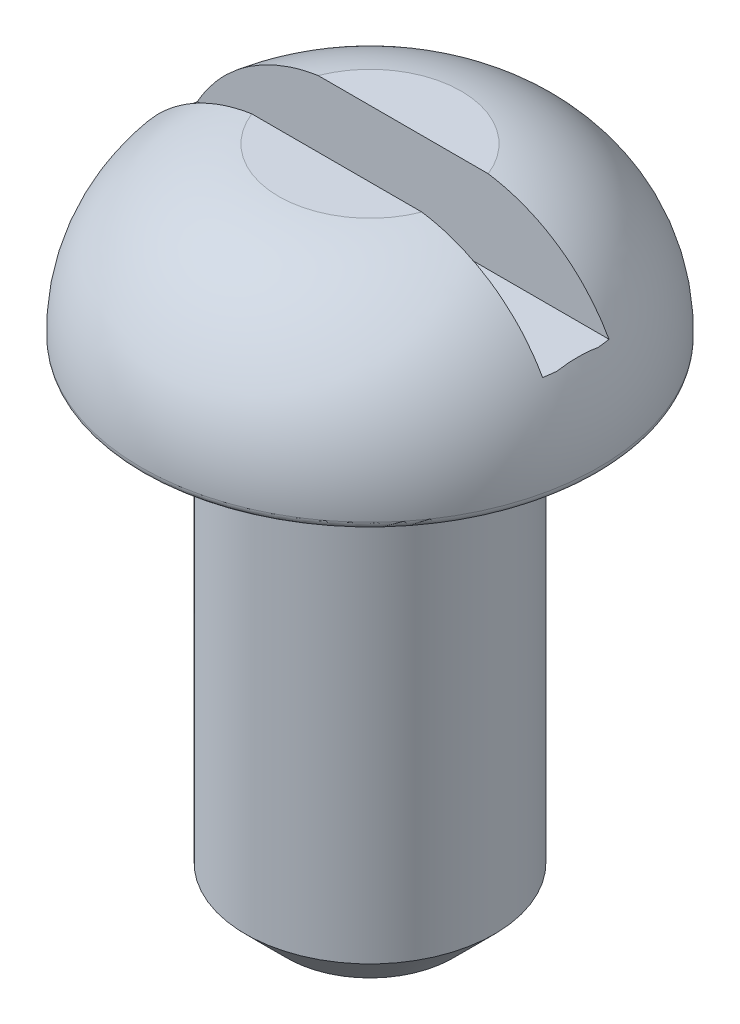
ISO-10303-21;
HEADER;
FILE_DESCRIPTION(('STEP AP214'),'2;1');
FILE_NAME('part.step','',(''),(''),'','','');
FILE_SCHEMA(('AUTOMOTIVE_DESIGN { 1 0 10303 214 1 1 1 1 }'));
ENDSEC;
DATA;
#1=APPLICATION_CONTEXT('core data for automotive mechanical design processes');
#2=APPLICATION_PROTOCOL_DEFINITION('international standard','automotive_design',2000,#1);
#3=PRODUCT_CONTEXT('',#1,'mechanical');
#4=PRODUCT('Part','Part','',(#3));
#5=PRODUCT_RELATED_PRODUCT_CATEGORY('part','',(#4));
#6=PRODUCT_DEFINITION_FORMATION('','',#4);
#7=PRODUCT_DEFINITION_CONTEXT('part definition',#1,'design');
#8=PRODUCT_DEFINITION('design','',#6,#7);
#9=PRODUCT_DEFINITION_SHAPE('','',#8);
#10=(LENGTH_UNIT() NAMED_UNIT(*) SI_UNIT(.MILLI.,.METRE.));
#11=(NAMED_UNIT(*) PLANE_ANGLE_UNIT() SI_UNIT($,.RADIAN.));
#12=(NAMED_UNIT(*) SI_UNIT($,.STERADIAN.) SOLID_ANGLE_UNIT());
#13=UNCERTAINTY_MEASURE_WITH_UNIT(LENGTH_MEASURE(1.E-05),#10,'distance_accuracy_value','');
#14=(GEOMETRIC_REPRESENTATION_CONTEXT(3) GLOBAL_UNCERTAINTY_ASSIGNED_CONTEXT((#13)) GLOBAL_UNIT_ASSIGNED_CONTEXT((#10,
#11,#12)) REPRESENTATION_CONTEXT('',''));
#15=CARTESIAN_POINT('',(0.,0.,0.));
#16=DIRECTION('',(0.,0.,1.));
#17=DIRECTION('',(1.,0.,0.));
#18=AXIS2_PLACEMENT_3D('',#15,#16,#17);
#19=CARTESIAN_POINT('',(0.,8.,0.));
#20=DIRECTION('',(0.,1.,0.));
#21=DIRECTION('',(0.,0.,1.));
#22=AXIS2_PLACEMENT_3D('',#19,#20,#21);
#23=PLANE('',#22);
#24=DIRECTION('',(-1.,0.,0.));
#25=VECTOR('',#24,1.);
#26=CARTESIAN_POINT('',(-2.5,8.,-0.4));
#27=LINE('',#26,#25);
#28=CARTESIAN_POINT('',(1.02469507659596,8.,-0.4));
#29=VERTEX_POINT('',#28);
#30=CARTESIAN_POINT('',(-1.02469507659596,8.,-0.4));
#31=VERTEX_POINT('',#30);
#32=EDGE_CURVE('E95',#29,#31,#27,.T.);
#33=ORIENTED_EDGE('',*,*,#32,.F.);
#34=CARTESIAN_POINT('',(0.,8.,0.));
#35=DIRECTION('',(0.,-1.,0.));
#36=DIRECTION('',(0.,0.,-1.));
#37=AXIS2_PLACEMENT_3D('',#34,#35,#36);
#38=CIRCLE('',#37,1.1);
#39=EDGE_CURVE('E101',#31,#29,#38,.T.);
#40=ORIENTED_EDGE('',*,*,#39,.F.);
#41=EDGE_LOOP('',(#33,#40));
#42=FACE_BOUND('',#41,.T.);
#43=ADVANCED_FACE('F29',(#42),#23,.T.);
#44=CARTESIAN_POINT('',(1.,0.,0.));
#45=DIRECTION('',(0.,-1.,0.));
#46=DIRECTION('',(0.,0.,-1.));
#47=AXIS2_PLACEMENT_3D('',#44,#45,#46);
#48=PLANE('',#47);
#49=CARTESIAN_POINT('',(0.,0.,0.));
#50=DIRECTION('',(0.,-1.,0.));
#51=DIRECTION('',(0.,0.,-1.));
#52=AXIS2_PLACEMENT_3D('',#49,#50,#51);
#53=CIRCLE('',#52,1.);
#54=CARTESIAN_POINT('',(0.,0.,-1.));
#55=VERTEX_POINT('',#54);
#56=EDGE_CURVE('E223',#55,#55,#53,.T.);
#57=ORIENTED_EDGE('',*,*,#56,.T.);
#58=EDGE_LOOP('',(#57));
#59=FACE_BOUND('',#58,.T.);
#60=ADVANCED_FACE('F31',(#59),#48,.T.);
#61=DIRECTION('',(1.,0.,0.));
#62=VECTOR('',#61,1.);
#63=CARTESIAN_POINT('',(-2.5,8.,0.4));
#64=LINE('',#63,#62);
#65=CARTESIAN_POINT('',(-1.02469507659596,8.,0.4));
#66=VERTEX_POINT('',#65);
#67=CARTESIAN_POINT('',(1.02469507659596,8.,0.4));
#68=VERTEX_POINT('',#67);
#69=EDGE_CURVE('E87',#66,#68,#64,.T.);
#70=ORIENTED_EDGE('',*,*,#69,.F.);
#71=EDGE_CURVE('E94',#68,#66,#38,.T.);
#72=ORIENTED_EDGE('',*,*,#71,.F.);
#73=EDGE_LOOP('',(#70,#72));
#74=FACE_BOUND('',#73,.T.);
#75=ADVANCED_FACE('F93',(#74),#23,.T.);
#76=CARTESIAN_POINT('',(0.,6.05009977634097,0.));
#77=DIRECTION('',(0.,-1.,0.));
#78=DIRECTION('',(0.,0.,-1.));
#79=AXIS2_PLACEMENT_3D('',#76,#77,#78);
#80=DEGENERATE_TOROIDAL_SURFACE('',#79,0.779672442615773,1.97603659537097,.T.);
#81=CARTESIAN_POINT('',(0.,7.98931855269485,0.4));
#82=CARTESIAN_POINT('',(0.0336322301279484,7.9893205716001,0.4));
#83=CARTESIAN_POINT('',(0.0672648143564294,7.99017844682175,0.4));
#84=CARTESIAN_POINT('',(0.134486048973814,7.99327874083744,0.4));
#85=CARTESIAN_POINT('',(0.168074638300507,7.99552232790957,0.4));
#86=CARTESIAN_POINT('',(0.235341692539278,8.00067558818296,0.4));
#87=CARTESIAN_POINT('',(0.269019918116884,8.00358809943584,0.4));
#88=CARTESIAN_POINT('',(0.336378018840053,8.0093648088338,0.4));
#89=CARTESIAN_POINT('',(0.370057893639487,8.01222901081593,0.4));
#90=CARTESIAN_POINT('',(0.437877287244912,8.01741118165353,0.4));
#91=CARTESIAN_POINT('',(0.472017389468459,8.01972204093967,0.4));
#92=CARTESIAN_POINT('',(0.540348220697958,8.02338246210221,0.4));
#93=CARTESIAN_POINT('',(0.574538947867759,8.02473205802703,0.4));
#94=CARTESIAN_POINT('',(0.677147719963298,8.02694911285574,0.4));
#95=CARTESIAN_POINT('',(0.745623445649574,8.02598680398459,0.4));
#96=CARTESIAN_POINT('',(0.881972396232885,8.01810011034374,0.4));
#97=CARTESIAN_POINT('',(0.949846939653067,8.01120009356238,0.4));
#98=CARTESIAN_POINT('',(1.08464932382839,7.99105274779902,0.4));
#99=CARTESIAN_POINT('',(1.1515770535867,7.97780468086785,0.4));
#100=CARTESIAN_POINT('',(1.32743905883569,7.93389987134993,0.4));
#101=CARTESIAN_POINT('',(1.43501246700903,7.89752417313685,0.4));
#102=CARTESIAN_POINT('',(1.64277375092832,7.80714096430149,0.4));
#103=CARTESIAN_POINT('',(1.74294278143891,7.75309024258769,0.4));
#104=CARTESIAN_POINT('',(1.93265776354999,7.6286817859467,0.4));
#105=CARTESIAN_POINT('',(2.02220009208707,7.55831851343564,0.4));
#106=CARTESIAN_POINT('',(2.18779655682164,7.40332750087542,0.4));
#107=CARTESIAN_POINT('',(2.26386325268286,7.31871318823932,0.4));
#108=CARTESIAN_POINT('',(2.39887936251544,7.1395132914902,0.4));
#109=CARTESIAN_POINT('',(2.4581485407167,7.04516847216825,0.4));
#110=CARTESIAN_POINT('',(2.55988756159558,6.84778550701506,0.4));
#111=CARTESIAN_POINT('',(2.60235359515437,6.74474539645659,0.4));
#112=CARTESIAN_POINT('',(2.66896720325158,6.53374228552121,0.4));
#113=CARTESIAN_POINT('',(2.69324730817994,6.4258211017661,0.4));
#114=CARTESIAN_POINT('',(2.72329499940504,6.20744823782144,0.4));
#115=CARTESIAN_POINT('',(2.72906565960174,6.09699698087495,0.4));
#116=CARTESIAN_POINT('',(2.72194370625239,5.87696236883574,0.4));
#117=CARTESIAN_POINT('',(2.70909546504866,5.76737757402577,0.4));
#118=CARTESIAN_POINT('',(2.66518054080641,5.55188571140622,0.4));
#119=CARTESIAN_POINT('',(2.63410816106256,5.44597980455422,0.4));
#120=CARTESIAN_POINT('',(2.55461964830541,5.2408306457122,0.4));
#121=CARTESIAN_POINT('',(2.50619477197843,5.14159078249458,0.4));
#122=CARTESIAN_POINT('',(2.39346155608861,4.95273088408203,0.4));
#123=CARTESIAN_POINT('',(2.32917055267637,4.86310050138865,0.4));
#124=CARTESIAN_POINT('',(2.18644835327305,4.69571647435829,0.4));
#125=CARTESIAN_POINT('',(2.10799740164992,4.61797970730241,0.4));
#126=CARTESIAN_POINT('',(1.93891521729073,4.47637070602941,0.4));
#127=CARTESIAN_POINT('',(1.84824228313099,4.4125479889316,0.4));
#128=CARTESIAN_POINT('',(1.70483704950054,4.32845353975036,0.4));
#129=CARTESIAN_POINT('',(1.65548996211767,4.30224282235778,0.4));
#130=CARTESIAN_POINT('',(1.55478898942816,4.25401999092746,0.4));
#131=CARTESIAN_POINT('',(1.50343572310356,4.23200659399397,0.4));
#132=CARTESIAN_POINT('',(1.39961052954736,4.19248489891929,0.4));
#133=CARTESIAN_POINT('',(1.347154703557,4.17493417047835,0.4));
#134=CARTESIAN_POINT('',(1.2409666890078,4.144087442157,0.4));
#135=CARTESIAN_POINT('',(1.18723349557358,4.1307949196762,0.4));
#136=CARTESIAN_POINT('',(1.06403178522894,4.10540925143501,0.4));
#137=CARTESIAN_POINT('',(0.994285023188462,4.09464216463719,0.4));
#138=CARTESIAN_POINT('',(0.889221117660143,4.08346831458643,0.4));
#139=CARTESIAN_POINT('',(0.854144078017131,4.08057337378565,0.4));
#140=CARTESIAN_POINT('',(0.783890511350764,4.07635427432128,0.4));
#141=CARTESIAN_POINT('',(0.748713977069504,4.07503023337692,0.4));
#142=CARTESIAN_POINT('',(0.677638959238742,4.07382766649051,0.4));
#143=CARTESIAN_POINT('',(0.641740038461016,4.07397842909007,0.4));
#144=CARTESIAN_POINT('',(0.569980696305404,4.07560637957031,0.4));
#145=CARTESIAN_POINT('',(0.534120269672291,4.0770833545146,0.4));
#146=CARTESIAN_POINT('',(0.462484408653184,4.08107184682247,0.4));
#147=CARTESIAN_POINT('',(0.426708933647403,4.0835826767192,0.4));
#148=CARTESIAN_POINT('',(0.355202454218464,4.08919106283036,0.4));
#149=CARTESIAN_POINT('',(0.319471456309081,4.09228869666957,0.4));
#150=CARTESIAN_POINT('',(0.242092989679404,4.09891537046343,0.4));
#151=CARTESIAN_POINT('',(0.200444216725484,4.10243104449401,0.4));
#152=CARTESIAN_POINT('',(0.117048492487839,4.10793876047994,0.4));
#153=CARTESIAN_POINT('',(0.0753016013203355,4.10993157004803,0.4));
#154=CARTESIAN_POINT('',(-0.00826329739639924,4.11128251065854,0.4));
#155=CARTESIAN_POINT('',(-0.0500813291633768,4.11063940172565,0.4));
#156=CARTESIAN_POINT('',(-0.13363965362681,4.10710338129502,0.4));
#157=CARTESIAN_POINT('',(-0.175379845783731,4.10420849425574,0.4));
#158=CARTESIAN_POINT('',(-0.258750304049284,4.09759434000433,0.4));
#159=CARTESIAN_POINT('',(-0.300380631753062,4.09387574128071,0.4));
#160=CARTESIAN_POINT('',(-0.383666399543701,4.08687617469604,0.4));
#161=CARTESIAN_POINT('',(-0.425321824593216,4.0835950450587,0.4));
#162=CARTESIAN_POINT('',(-0.508683231706592,4.07829633581178,0.4));
#163=CARTESIAN_POINT('',(-0.550389134860386,4.07627762499527,0.4));
#164=CARTESIAN_POINT('',(-0.633847536707231,4.07399446673123,0.4));
#165=CARTESIAN_POINT('',(-0.675600033238147,4.07372994101215,0.4));
#166=CARTESIAN_POINT('',(-0.798279554043541,4.07599985703047,0.4));
#167=CARTESIAN_POINT('',(-0.879185473529218,4.08139508938235,0.4));
#168=CARTESIAN_POINT('',(-1.04009545442695,4.10108936309313,0.4));
#169=CARTESIAN_POINT('',(-1.120097312929,4.11540673598556,0.4));
#170=CARTESIAN_POINT('',(-1.27744036603237,4.15313717677758,0.4));
#171=CARTESIAN_POINT('',(-1.35479443169432,4.17649630804985,0.4));
#172=CARTESIAN_POINT('',(-1.50607354050179,4.23220037272841,0.4));
#173=CARTESIAN_POINT('',(-1.58000406828913,4.26453030927327,0.4));
#174=CARTESIAN_POINT('',(-1.70066637437023,4.32620164457039,0.4));
#175=CARTESIAN_POINT('',(-1.74858977096691,4.35324055633358,0.4));
#176=CARTESIAN_POINT('',(-1.84204738578041,4.41119705677251,0.4));
#177=CARTESIAN_POINT('',(-1.88758126390447,4.4421151954546,0.4));
#178=CARTESIAN_POINT('',(-1.97648927226609,4.50805504558629,0.4));
#179=CARTESIAN_POINT('',(-2.01982815044721,4.54312436341345,0.4));
#180=CARTESIAN_POINT('',(-2.10337243061366,4.61678085845386,0.4));
#181=CARTESIAN_POINT('',(-2.14357835593788,4.65536744578403,0.4));
#182=CARTESIAN_POINT('',(-2.25876075366807,4.77572720348253,0.4));
#183=CARTESIAN_POINT('',(-2.3287261986615,4.86241560047963,0.4));
#184=CARTESIAN_POINT('',(-2.45273016359909,5.04594486934812,0.4));
#185=CARTESIAN_POINT('',(-2.50683160667456,5.14274350788808,0.4));
#186=CARTESIAN_POINT('',(-2.59789639376451,5.34393303608959,0.4));
#187=CARTESIAN_POINT('',(-2.63488542916094,5.44831227036988,0.4));
#188=CARTESIAN_POINT('',(-2.69078481684573,5.66192713634907,0.4));
#189=CARTESIAN_POINT('',(-2.70967494073831,5.77116805944685,0.4));
#190=CARTESIAN_POINT('',(-2.72872049994938,5.99083950597841,0.4));
#191=CARTESIAN_POINT('',(-2.72894896278393,6.10126370098525,0.4));
#192=CARTESIAN_POINT('',(-2.71085046679964,6.32054549822341,0.4));
#193=CARTESIAN_POINT('',(-2.69252940318255,6.42940358702928,0.4));
#194=CARTESIAN_POINT('',(-2.63788660496968,6.64243700752175,0.4));
#195=CARTESIAN_POINT('',(-2.60157509032427,6.74661496127792,0.4));
#196=CARTESIAN_POINT('',(-2.51199794489186,6.9474252587672,0.4));
#197=CARTESIAN_POINT('',(-2.45872965131868,7.04405641442852,0.4));
#198=CARTESIAN_POINT('',(-2.33667666099479,7.22719648017854,0.4));
#199=CARTESIAN_POINT('',(-2.26786608902608,7.3136881407663,0.4));
#200=CARTESIAN_POINT('',(-2.11678830197829,7.47393638064339,0.4));
#201=CARTESIAN_POINT('',(-2.03452512343716,7.54769676642616,0.4));
#202=CARTESIAN_POINT('',(-1.85845680132224,7.68087682539437,0.4));
#203=CARTESIAN_POINT('',(-1.76459390280113,7.74021998734935,0.4));
#204=CARTESIAN_POINT('',(-1.56825068819718,7.84262599868148,0.4));
#205=CARTESIAN_POINT('',(-1.46576450258911,7.88567764769672,0.4));
#206=CARTESIAN_POINT('',(-1.30705768686081,7.93767741598374,0.4));
#207=CARTESIAN_POINT('',(-1.25283407094741,7.95299054212591,0.4));
#208=CARTESIAN_POINT('',(-1.1433101061746,7.97919836316372,0.4));
#209=CARTESIAN_POINT('',(-1.0880096191571,7.99009248715328,0.4));
#210=CARTESIAN_POINT('',(-0.976811740038267,8.00751761709941,0.4));
#211=CARTESIAN_POINT('',(-0.920915266039552,8.01405456009372,0.4));
#212=CARTESIAN_POINT('',(-0.808825447819218,8.02300468210458,0.4));
#213=CARTESIAN_POINT('',(-0.752632245417603,8.02541967877984,0.4));
#214=CARTESIAN_POINT('',(-0.638202420490259,8.02659544540267,0.4));
#215=CARTESIAN_POINT('',(-0.579964874932384,8.02522189040679,0.4));
#216=CARTESIAN_POINT('',(-0.463602771262357,8.0194855430093,0.4));
#217=CARTESIAN_POINT('',(-0.405478390226011,8.015119687082,0.4));
#218=CARTESIAN_POINT('',(-0.318466264025539,8.00786026060458,0.4));
#219=CARTESIAN_POINT('',(-0.289542668712615,8.00532715255684,0.4));
#220=CARTESIAN_POINT('',(-0.231677824652625,8.00043581203148,0.4));
#221=CARTESIAN_POINT('',(-0.202736575195285,7.998077587132,0.4));
#222=CARTESIAN_POINT('',(-0.144850436771987,7.99400846001751,0.4));
#223=CARTESIAN_POINT('',(-0.115905623626876,7.99229655568349,0.4));
#224=CARTESIAN_POINT('',(-0.0579739548392637,7.98995084154621,0.4));
#225=CARTESIAN_POINT('',(-0.0289871089406184,7.98931681263105,0.4));
#226=CARTESIAN_POINT('',(0.,7.98931855269485,0.4));
#227=B_SPLINE_CURVE_WITH_KNOTS('',3,(#81,#82,#83,#84,#85,#86,#87,#88,#89,#90,#91,#92,#93,#94,
#95,#96,#97,#98,#99,#100,#101,#102,#103,#104,#105,#106,#107,#108,#109,#110,#111,#112,#113,#114,
#115,#116,#117,#118,#119,#120,#121,#122,#123,#124,#125,#126,#127,#128,#129,#130,#131,#132,#133,
#134,#135,#136,#137,#138,#139,#140,#141,#142,#143,#144,#145,#146,#147,#148,#149,#150,#151,#152,
#153,#154,#155,#156,#157,#158,#159,#160,#161,#162,#163,#164,#165,#166,#167,#168,#169,#170,#171,
#172,#173,#174,#175,#176,#177,#178,#179,#180,#181,#182,#183,#184,#185,#186,#187,#188,#189,#190,
#191,#192,#193,#194,#195,#196,#197,#198,#199,#200,#201,#202,#203,#204,#205,#206,#207,#208,#209,
#210,#211,#212,#213,#214,#215,#216,#217,#218,#219,#220,#221,#222,#223,#224,#225,#226),
.UNSPECIFIED.,.T.,.F.,(4,2,2,2,2,2,2,2,2,2,2,2,2,2,2,2,2,2,2,2,2,2,2,2,2,2,2,2,2,2,2,2,2,2,2,2,
2,2,2,2,2,2,2,2,2,2,2,2,2,2,2,2,2,2,2,2,2,2,2,2,2,2,2,2,2,2,2,2,2,2,2,2,4),(0.,
0.100890023684147,0.20186522294138,0.303277014523181,0.404680713008293,0.507324699032976,
0.60996504917535,0.815182329830901,1.01956140617602,1.2239642469793,1.56297001300182,
1.9028108396941,2.24276720072985,2.58240502666488,2.91506020623248,3.24779075253565,
3.57807227226821,3.90829893865739,4.23773990589672,4.56728390841,4.89699419059368,
5.22634579707033,5.55616050998684,5.88713046661354,6.05459853805703,6.2220153411517,
6.3877752381392,6.55367015739327,6.76501012148147,6.87057116918616,6.97614012686718,
7.08380979826553,7.19146218533487,7.2990431037374,7.4066382633275,7.53202567740019,
7.65734984711897,7.78273297795789,7.90822623480998,8.03361801752368,8.15896330091042,
8.28419610546772,8.40942332211289,8.65221314412582,8.89550345712302,9.1373643017585,
9.37882322878403,9.5437251905997,9.70865055909825,9.87569425907161,10.0427099954236,
10.3751757055228,10.7063043070527,11.0369341487598,11.3679330920179,11.6976366954212,
12.0272355490161,12.3566473796013,12.6861109644934,13.0161271461231,13.346044485437,
13.6776761947943,14.0095354874336,14.178415684656,14.347317693148,14.5159890849235,
14.6845860782746,14.8592368371135,15.0340666714877,15.1211717845946,15.208280669984,
15.2952539330296,15.3822095139242),.UNSPECIFIED.);
#228=CARTESIAN_POINT('',(-2.48037267208639,7.,0.4));
#229=VERTEX_POINT('',#228);
#230=EDGE_CURVE('E11',#229,#66,#227,.T.);
#231=ORIENTED_EDGE('',*,*,#230,.F.);
#232=CARTESIAN_POINT('',(0.,7.,0.));
#233=DIRECTION('',(0.,1.,0.));
#234=DIRECTION('',(0.,0.,1.));
#235=AXIS2_PLACEMENT_3D('',#232,#233,#234);
#236=CIRCLE('',#235,2.51241887280624);
#237=CARTESIAN_POINT('',(-2.5,7.,0.24949667820031));
#238=VERTEX_POINT('',#237);
#239=EDGE_CURVE('E42',#229,#238,#236,.F.);
#240=ORIENTED_EDGE('',*,*,#239,.T.);
#241=CARTESIAN_POINT('',(-2.5,7.02231051560983,0.));
#242=CARTESIAN_POINT('',(-2.5,7.02231014613126,0.0712306788425633));
#243=CARTESIAN_POINT('',(-2.5,7.0169240888941,0.142558865114006));
#244=CARTESIAN_POINT('',(-2.5,6.99524833344987,0.283701712225144));
#245=CARTESIAN_POINT('',(-2.5,6.97893018759636,0.353511932388624));
#246=CARTESIAN_POINT('',(-2.5,6.93503448743744,0.489880588433876));
#247=CARTESIAN_POINT('',(-2.5,6.90741010654933,0.556424195769016));
#248=CARTESIAN_POINT('',(-2.5,6.8407369512236,0.683471035223088));
#249=CARTESIAN_POINT('',(-2.5,6.80171066461155,0.74398584577809));
#250=CARTESIAN_POINT('',(-2.5,6.72273078631452,0.843275760575027));
#251=CARTESIAN_POINT('',(-2.5,6.68504077468055,0.883854319520756));
#252=CARTESIAN_POINT('',(-2.5,6.60345396988963,0.958249349802384));
#253=CARTESIAN_POINT('',(-2.5,6.55955954334448,0.992068387670539));
#254=CARTESIAN_POINT('',(-2.5,6.46614541066803,1.0515647045904));
#255=CARTESIAN_POINT('',(-2.5,6.41659333803926,1.07719158850154));
#256=CARTESIAN_POINT('',(-2.5,6.31351364402817,1.11857305743128));
#257=CARTESIAN_POINT('',(-2.5,6.25998836215314,1.13433340129616));
#258=CARTESIAN_POINT('',(-2.5,6.15684471263327,1.15387563353978));
#259=CARTESIAN_POINT('',(-2.5,6.10743646195621,1.15877596536218));
#260=CARTESIAN_POINT('',(-2.5,6.0085452840721,1.15971101314125));
#261=CARTESIAN_POINT('',(-2.5,5.95906239205351,1.15574907177318));
#262=CARTESIAN_POINT('',(-2.5,5.86411851550254,1.13961207805656));
#263=CARTESIAN_POINT('',(-2.5,5.81858208628391,1.12787399445516));
#264=CARTESIAN_POINT('',(-2.5,5.73002594829075,1.09717394472953));
#265=CARTESIAN_POINT('',(-2.5,5.68700637658874,1.07821158558015));
#266=CARTESIAN_POINT('',(-2.5,5.60297401465296,1.03306389528727));
#267=CARTESIAN_POINT('',(-2.5,5.56208688516073,1.00664580851613));
#268=CARTESIAN_POINT('',(-2.5,5.48478671975293,0.947939477777542));
#269=CARTESIAN_POINT('',(-2.5,5.44837523694311,0.915649205671528));
#270=CARTESIAN_POINT('',(-2.5,5.37688415061919,0.842566073313486));
#271=CARTESIAN_POINT('',(-2.5,5.34235687266141,0.801234383081301));
#272=CARTESIAN_POINT('',(-2.5,5.27963990234519,0.714029036243395));
#273=CARTESIAN_POINT('',(-2.5,5.25145347759936,0.668153055300622));
#274=CARTESIAN_POINT('',(-2.5,5.19762640831853,0.56570561158647));
#275=CARTESIAN_POINT('',(-2.5,5.17304925893739,0.508575952252563));
#276=CARTESIAN_POINT('',(-2.5,5.13232205749344,0.391397341288987));
#277=CARTESIAN_POINT('',(-2.5,5.11617692086437,0.33134670912605));
#278=CARTESIAN_POINT('',(-2.5,5.09021129797167,0.199724484838878));
#279=CARTESIAN_POINT('',(-2.5,5.08184217840077,0.127864571020887));
#280=CARTESIAN_POINT('',(-2.5,5.07613814300471,-0.0163393775210936));
#281=CARTESIAN_POINT('',(-2.5,5.07881401975147,-0.0886838167684117));
#282=CARTESIAN_POINT('',(-2.5,5.09604186513654,-0.238852141273036));
#283=CARTESIAN_POINT('',(-2.5,5.11168190921542,-0.316555155132487));
#284=CARTESIAN_POINT('',(-2.5,5.15654537923408,-0.46792832799044));
#285=CARTESIAN_POINT('',(-2.5,5.18575221829127,-0.541603289127115));
#286=CARTESIAN_POINT('',(-2.5,5.24966259731633,-0.665743650160989));
#287=CARTESIAN_POINT('',(-2.5,5.28156459660841,-0.717654202163196));
#288=CARTESIAN_POINT('',(-2.5,5.35347835023177,-0.815560730450135));
#289=CARTESIAN_POINT('',(-2.5,5.39348640053243,-0.861559392517834));
#290=CARTESIAN_POINT('',(-2.5,5.48148468689641,-0.94600006669602));
#291=CARTESIAN_POINT('',(-2.5,5.52953463612758,-0.984380466316214));
#292=CARTESIAN_POINT('',(-2.5,5.6322573046179,-1.05096309856745));
#293=CARTESIAN_POINT('',(-2.5,5.68692394977712,-1.07917457297966));
#294=CARTESIAN_POINT('',(-2.5,5.79307039548012,-1.12047369115394));
#295=CARTESIAN_POINT('',(-2.5,5.84394870147081,-1.1351112921511));
#296=CARTESIAN_POINT('',(-2.5,5.94753962820183,-1.15459744549457));
#297=CARTESIAN_POINT('',(-2.5,6.00025091501122,-1.15945297101361));
#298=CARTESIAN_POINT('',(-2.5,6.1004596648121,-1.15911656356735));
#299=CARTESIAN_POINT('',(-2.5,6.14796294964309,-1.1548606781451));
#300=CARTESIAN_POINT('',(-2.5,6.24155559060142,-1.13837987259775));
#301=CARTESIAN_POINT('',(-2.5,6.28764514563643,-1.12615607896912));
#302=CARTESIAN_POINT('',(-2.5,6.37694763368273,-1.09439743039534));
#303=CARTESIAN_POINT('',(-2.5,6.42017402232899,-1.07490012929803));
#304=CARTESIAN_POINT('',(-2.5,6.50305034194318,-1.02941245372522));
#305=CARTESIAN_POINT('',(-2.5,6.54269937916833,-1.00342046273776));
#306=CARTESIAN_POINT('',(-2.5,6.62055136516311,-0.943733525554365));
#307=CARTESIAN_POINT('',(-2.5,6.6584219937318,-0.909606632222672));
#308=CARTESIAN_POINT('',(-2.5,6.72871751030709,-0.836166720546381));
#309=CARTESIAN_POINT('',(-2.5,6.76114062595824,-0.796852021741519));
#310=CARTESIAN_POINT('',(-2.5,6.82428707291293,-0.708603935542906));
#311=CARTESIAN_POINT('',(-2.5,6.85419467708597,-0.659088099147598));
#312=CARTESIAN_POINT('',(-2.5,6.90664449994322,-0.556273142143709));
#313=CARTESIAN_POINT('',(-2.5,6.92917840946965,-0.502969835297219));
#314=CARTESIAN_POINT('',(-2.5,6.9700907472227,-0.384754626029003));
#315=CARTESIAN_POINT('',(-2.5,6.98715155139994,-0.319388131208308));
#316=CARTESIAN_POINT('',(-2.5,7.01150494008411,-0.18696480593488));
#317=CARTESIAN_POINT('',(-2.5,7.01881409678225,-0.119911041019669));
#318=CARTESIAN_POINT('',(-2.5,7.02198216855268,-0.0351795517586165));
#319=CARTESIAN_POINT('',(-2.5,7.02231060686467,-0.0175927498795481));
#320=CARTESIAN_POINT('',(-2.5,7.02231051560983,0.));
#321=B_SPLINE_CURVE_WITH_KNOTS('',3,(#241,#242,#243,#244,#245,#246,#247,#248,#249,#250,#251,
#252,#253,#254,#255,#256,#257,#258,#259,#260,#261,#262,#263,#264,#265,#266,#267,#268,#269,#270,
#271,#272,#273,#274,#275,#276,#277,#278,#279,#280,#281,#282,#283,#284,#285,#286,#287,#288,#289,
#290,#291,#292,#293,#294,#295,#296,#297,#298,#299,#300,#301,#302,#303,#304,#305,#306,#307,#308,
#309,#310,#311,#312,#313,#314,#315,#316,#317,#318,#319,#320),.UNSPECIFIED.,.T.,.F.,(4,2,2,2,2,2,
2,2,2,2,2,2,2,2,2,2,2,2,2,2,2,2,2,2,2,2,2,2,2,2,2,2,2,2,2,2,2,2,2,4),(0.,0.213654058428576,
0.427866261467031,0.642974783844953,0.857661882047721,1.02313256849238,1.18854030728179,
1.35494682143161,1.52125611759126,1.6694369131548,1.81756182725976,1.95799843379395,
2.09844268164834,2.24387837543208,2.38936439560361,2.55030448513531,2.71132732241044,
2.89719032712376,3.08316155989775,3.29930936619596,3.51566843039356,3.7522771145924,
3.98859727727576,4.17066050848427,4.35264073342776,4.53603759006511,4.71926734814893,
4.87720820490712,5.03503643330441,5.17743169042945,5.31980682019252,5.46145680385799,
5.60314207902791,5.75546979409162,5.90784697360662,6.08072712684902,6.25380142712086,
6.45570811901972,6.65727124675774,6.71004011646053),.UNSPECIFIED.);
#322=CARTESIAN_POINT('',(-2.5,7.,-0.24949667820031));
#323=VERTEX_POINT('',#322);
#324=EDGE_CURVE('E33',#323,#238,#321,.T.);
#325=ORIENTED_EDGE('',*,*,#324,.F.);
#326=CARTESIAN_POINT('',(-2.48037267208639,7.,-0.4));
#327=VERTEX_POINT('',#326);
#328=EDGE_CURVE('E202',#323,#327,#236,.F.);
#329=ORIENTED_EDGE('',*,*,#328,.T.);
#330=CARTESIAN_POINT('',(0.,7.98931855269485,-0.4));
#331=CARTESIAN_POINT('',(-0.0336322301279488,7.9893205716001,-0.4));
#332=CARTESIAN_POINT('',(-0.0672648143564299,7.99017844682175,-0.4));
#333=CARTESIAN_POINT('',(-0.134486048973815,7.99327874083744,-0.4));
#334=CARTESIAN_POINT('',(-0.168074638300507,7.99552232790957,-0.4));
#335=CARTESIAN_POINT('',(-0.235341692539278,8.00067558818296,-0.4));
#336=CARTESIAN_POINT('',(-0.269019918116885,8.00358809943584,-0.4));
#337=CARTESIAN_POINT('',(-0.336378018840054,8.0093648088338,-0.4));
#338=CARTESIAN_POINT('',(-0.370057893639487,8.01222901081593,-0.4));
#339=CARTESIAN_POINT('',(-0.437877287244913,8.01741118165353,-0.4));
#340=CARTESIAN_POINT('',(-0.47201738946846,8.01972204093967,-0.4));
#341=CARTESIAN_POINT('',(-0.54034822069796,8.02338246210221,-0.4));
#342=CARTESIAN_POINT('',(-0.57453894786776,8.02473205802703,-0.4));
#343=CARTESIAN_POINT('',(-0.6771477199633,8.02694911285574,-0.4));
#344=CARTESIAN_POINT('',(-0.745623445649575,8.02598680398459,-0.4));
#345=CARTESIAN_POINT('',(-0.881972396232886,8.01810011034374,-0.4));
#346=CARTESIAN_POINT('',(-0.949846939653069,8.01120009356238,-0.4));
#347=CARTESIAN_POINT('',(-1.08464932382839,7.99105274779902,-0.4));
#348=CARTESIAN_POINT('',(-1.1515770535867,7.97780468086785,-0.4));
#349=CARTESIAN_POINT('',(-1.32743905883569,7.93389987134993,-0.4));
#350=CARTESIAN_POINT('',(-1.43501246700903,7.89752417313685,-0.4));
#351=CARTESIAN_POINT('',(-1.64277375092832,7.80714096430149,-0.4));
#352=CARTESIAN_POINT('',(-1.74294278143891,7.75309024258769,-0.4));
#353=CARTESIAN_POINT('',(-1.93265776354999,7.62868178594669,-0.4));
#354=CARTESIAN_POINT('',(-2.02220009208707,7.55831851343564,-0.4));
#355=CARTESIAN_POINT('',(-2.18779655682164,7.40332750087542,-0.4));
#356=CARTESIAN_POINT('',(-2.26386325268286,7.31871318823931,-0.4));
#357=CARTESIAN_POINT('',(-2.39887936251544,7.1395132914902,-0.4));
#358=CARTESIAN_POINT('',(-2.4581485407167,7.04516847216825,-0.4));
#359=CARTESIAN_POINT('',(-2.55988756159559,6.84778550701506,-0.4));
#360=CARTESIAN_POINT('',(-2.60235359515437,6.74474539645659,-0.4));
#361=CARTESIAN_POINT('',(-2.66896720325158,6.5337422855212,-0.4));
#362=CARTESIAN_POINT('',(-2.69324730817994,6.4258211017661,-0.4));
#363=CARTESIAN_POINT('',(-2.72329499940504,6.20744823782144,-0.4));
#364=CARTESIAN_POINT('',(-2.72906565960174,6.09699698087495,-0.4));
#365=CARTESIAN_POINT('',(-2.72194370625238,5.87696236883574,-0.4));
#366=CARTESIAN_POINT('',(-2.70909546504866,5.76737757402577,-0.4));
#367=CARTESIAN_POINT('',(-2.6651805408064,5.55188571140622,-0.4));
#368=CARTESIAN_POINT('',(-2.63410816106256,5.44597980455422,-0.4));
#369=CARTESIAN_POINT('',(-2.55461964830541,5.2408306457122,-0.4));
#370=CARTESIAN_POINT('',(-2.50619477197843,5.14159078249458,-0.4));
#371=CARTESIAN_POINT('',(-2.39346155608861,4.95273088408203,-0.4));
#372=CARTESIAN_POINT('',(-2.32917055267637,4.86310050138865,-0.4));
#373=CARTESIAN_POINT('',(-2.18644835327305,4.69571647435829,-0.4));
#374=CARTESIAN_POINT('',(-2.10799740164991,4.61797970730241,-0.4));
#375=CARTESIAN_POINT('',(-1.93891521729073,4.47637070602941,-0.4));
#376=CARTESIAN_POINT('',(-1.84824228313099,4.4125479889316,-0.4));
#377=CARTESIAN_POINT('',(-1.70483704950054,4.32845353975036,-0.4));
#378=CARTESIAN_POINT('',(-1.65548996211767,4.30224282235778,-0.4));
#379=CARTESIAN_POINT('',(-1.55478898942816,4.25401999092746,-0.4));
#380=CARTESIAN_POINT('',(-1.50343572310356,4.23200659399396,-0.4));
#381=CARTESIAN_POINT('',(-1.39961052954736,4.19248489891929,-0.4));
#382=CARTESIAN_POINT('',(-1.34715470355699,4.17493417047835,-0.4));
#383=CARTESIAN_POINT('',(-1.2409666890078,4.144087442157,-0.4));
#384=CARTESIAN_POINT('',(-1.18723349557358,4.1307949196762,-0.4));
#385=CARTESIAN_POINT('',(-1.06403178522894,4.10540925143501,-0.4));
#386=CARTESIAN_POINT('',(-0.99428502318846,4.09464216463719,-0.4));
#387=CARTESIAN_POINT('',(-0.88922111766014,4.08346831458643,-0.4));
#388=CARTESIAN_POINT('',(-0.854144078017128,4.08057337378565,-0.4));
#389=CARTESIAN_POINT('',(-0.783890511350761,4.07635427432128,-0.4));
#390=CARTESIAN_POINT('',(-0.748713977069501,4.07503023337692,-0.4));
#391=CARTESIAN_POINT('',(-0.677638959238738,4.07382766649051,-0.4));
#392=CARTESIAN_POINT('',(-0.641740038461012,4.07397842909007,-0.4));
#393=CARTESIAN_POINT('',(-0.5699806963054,4.07560637957031,-0.4));
#394=CARTESIAN_POINT('',(-0.534120269672287,4.0770833545146,-0.4));
#395=CARTESIAN_POINT('',(-0.46248440865318,4.08107184682247,-0.4));
#396=CARTESIAN_POINT('',(-0.426708933647399,4.0835826767192,-0.4));
#397=CARTESIAN_POINT('',(-0.35520245421846,4.08919106283036,-0.4));
#398=CARTESIAN_POINT('',(-0.319471456309076,4.09228869666957,-0.4));
#399=CARTESIAN_POINT('',(-0.242092989679399,4.09891537046343,-0.4));
#400=CARTESIAN_POINT('',(-0.200444216725479,4.10243104449401,-0.4));
#401=CARTESIAN_POINT('',(-0.117048492487833,4.10793876047994,-0.4));
#402=CARTESIAN_POINT('',(-0.075301601320329,4.10993157004803,-0.4));
#403=CARTESIAN_POINT('',(0.00826329739640587,4.11128251065854,-0.4));
#404=CARTESIAN_POINT('',(0.0500813291633835,4.11063940172565,-0.4));
#405=CARTESIAN_POINT('',(0.133639653626817,4.10710338129502,-0.4));
#406=CARTESIAN_POINT('',(0.175379845783738,4.10420849425574,-0.4));
#407=CARTESIAN_POINT('',(0.258750304049292,4.09759434000433,-0.4));
#408=CARTESIAN_POINT('',(0.30038063175307,4.09387574128071,-0.4));
#409=CARTESIAN_POINT('',(0.383666399543709,4.08687617469604,-0.4));
#410=CARTESIAN_POINT('',(0.425321824593225,4.0835950450587,-0.4));
#411=CARTESIAN_POINT('',(0.508683231706601,4.07829633581178,-0.4));
#412=CARTESIAN_POINT('',(0.550389134860395,4.07627762499527,-0.4));
#413=CARTESIAN_POINT('',(0.633847536707242,4.07399446673123,-0.4));
#414=CARTESIAN_POINT('',(0.675600033238158,4.07372994101215,-0.4));
#415=CARTESIAN_POINT('',(0.798279554043554,4.07599985703047,-0.4));
#416=CARTESIAN_POINT('',(0.87918547352923,4.08139508938235,-0.4));
#417=CARTESIAN_POINT('',(1.04009545442696,4.10108936309313,-0.4));
#418=CARTESIAN_POINT('',(1.12009731292901,4.11540673598557,-0.4));
#419=CARTESIAN_POINT('',(1.27744036603239,4.15313717677759,-0.4));
#420=CARTESIAN_POINT('',(1.35479443169434,4.17649630804986,-0.4));
#421=CARTESIAN_POINT('',(1.50607354050181,4.23220037272842,-0.4));
#422=CARTESIAN_POINT('',(1.58000406828915,4.26453030927328,-0.4));
#423=CARTESIAN_POINT('',(1.70066637437024,4.3262016445704,-0.4));
#424=CARTESIAN_POINT('',(1.74858977096693,4.35324055633359,-0.4));
#425=CARTESIAN_POINT('',(1.84204738578043,4.41119705677252,-0.4));
#426=CARTESIAN_POINT('',(1.88758126390449,4.44211519545461,-0.400000000000001));
#427=CARTESIAN_POINT('',(1.9764892722661,4.50805504558631,-0.400000000000001));
#428=CARTESIAN_POINT('',(2.01982815044723,4.54312436341346,-0.400000000000001));
#429=CARTESIAN_POINT('',(2.10337243061368,4.61678085845388,-0.400000000000001));
#430=CARTESIAN_POINT('',(2.1435783559379,4.65536744578404,-0.400000000000001));
#431=CARTESIAN_POINT('',(2.25876075366808,4.77572720348254,-0.400000000000001));
#432=CARTESIAN_POINT('',(2.32872619866151,4.86241560047965,-0.400000000000001));
#433=CARTESIAN_POINT('',(2.4527301635991,5.04594486934814,-0.400000000000001));
#434=CARTESIAN_POINT('',(2.50683160667457,5.1427435078881,-0.400000000000001));
#435=CARTESIAN_POINT('',(2.59789639376452,5.34393303608961,-0.400000000000001));
#436=CARTESIAN_POINT('',(2.63488542916094,5.4483122703699,-0.400000000000001));
#437=CARTESIAN_POINT('',(2.69078481684574,5.66192713634909,-0.400000000000001));
#438=CARTESIAN_POINT('',(2.70967494073832,5.77116805944687,-0.400000000000001));
#439=CARTESIAN_POINT('',(2.72872049994938,5.99083950597843,-0.400000000000001));
#440=CARTESIAN_POINT('',(2.72894896278393,6.10126370098527,-0.400000000000001));
#441=CARTESIAN_POINT('',(2.71085046679964,6.32054549822343,-0.400000000000001));
#442=CARTESIAN_POINT('',(2.69252940318255,6.4294035870293,-0.400000000000001));
#443=CARTESIAN_POINT('',(2.63788660496968,6.64243700752177,-0.400000000000001));
#444=CARTESIAN_POINT('',(2.60157509032426,6.74661496127794,-0.400000000000001));
#445=CARTESIAN_POINT('',(2.51199794489186,6.94742525876722,-0.400000000000001));
#446=CARTESIAN_POINT('',(2.45872965131867,7.04405641442854,-0.400000000000001));
#447=CARTESIAN_POINT('',(2.33667666099478,7.22719648017856,-0.400000000000001));
#448=CARTESIAN_POINT('',(2.26786608902607,7.31368814076631,-0.400000000000001));
#449=CARTESIAN_POINT('',(2.11678830197828,7.4739363806434,-0.400000000000001));
#450=CARTESIAN_POINT('',(2.03452512343714,7.54769676642617,-0.400000000000001));
#451=CARTESIAN_POINT('',(1.85845680132222,7.68087682539438,-0.400000000000001));
#452=CARTESIAN_POINT('',(1.76459390280111,7.74021998734936,-0.4));
#453=CARTESIAN_POINT('',(1.56825068819717,7.84262599868149,-0.4));
#454=CARTESIAN_POINT('',(1.46576450258909,7.88567764769673,-0.4));
#455=CARTESIAN_POINT('',(1.30705768686079,7.93767741598375,-0.4));
#456=CARTESIAN_POINT('',(1.25283407094739,7.95299054212592,-0.4));
#457=CARTESIAN_POINT('',(1.14331010617458,7.97919836316372,-0.4));
#458=CARTESIAN_POINT('',(1.08800961915708,7.99009248715329,-0.4));
#459=CARTESIAN_POINT('',(0.976811740038248,8.00751761709941,-0.4));
#460=CARTESIAN_POINT('',(0.920915266039533,8.01405456009372,-0.4));
#461=CARTESIAN_POINT('',(0.808825447819199,8.02300468210458,-0.4));
#462=CARTESIAN_POINT('',(0.752632245417583,8.02541967877984,-0.4));
#463=CARTESIAN_POINT('',(0.63820242049024,8.02659544540267,-0.4));
#464=CARTESIAN_POINT('',(0.579964874932367,8.02522189040679,-0.4));
#465=CARTESIAN_POINT('',(0.463602771262344,8.0194855430093,-0.4));
#466=CARTESIAN_POINT('',(0.405478390225999,8.015119687082,-0.4));
#467=CARTESIAN_POINT('',(0.318466264025529,8.00786026060458,-0.4));
#468=CARTESIAN_POINT('',(0.289542668712606,8.00532715255684,-0.4));
#469=CARTESIAN_POINT('',(0.231677824652618,8.00043581203148,-0.4));
#470=CARTESIAN_POINT('',(0.202736575195278,7.998077587132,-0.4));
#471=CARTESIAN_POINT('',(0.144850436771983,7.99400846001751,-0.4));
#472=CARTESIAN_POINT('',(0.115905623626873,7.99229655568349,-0.4));
#473=CARTESIAN_POINT('',(0.0579739548392622,7.98995084154621,-0.4));
#474=CARTESIAN_POINT('',(0.0289871089406174,7.98931681263105,-0.4));
#475=CARTESIAN_POINT('',(0.,7.98931855269485,-0.4));
#476=B_SPLINE_CURVE_WITH_KNOTS('',3,(#330,#331,#332,#333,#334,#335,#336,#337,#338,#339,#340,
#341,#342,#343,#344,#345,#346,#347,#348,#349,#350,#351,#352,#353,#354,#355,#356,#357,#358,#359,
#360,#361,#362,#363,#364,#365,#366,#367,#368,#369,#370,#371,#372,#373,#374,#375,#376,#377,#378,
#379,#380,#381,#382,#383,#384,#385,#386,#387,#388,#389,#390,#391,#392,#393,#394,#395,#396,#397,
#398,#399,#400,#401,#402,#403,#404,#405,#406,#407,#408,#409,#410,#411,#412,#413,#414,#415,#416,
#417,#418,#419,#420,#421,#422,#423,#424,#425,#426,#427,#428,#429,#430,#431,#432,#433,#434,#435,
#436,#437,#438,#439,#440,#441,#442,#443,#444,#445,#446,#447,#448,#449,#450,#451,#452,#453,#454,
#455,#456,#457,#458,#459,#460,#461,#462,#463,#464,#465,#466,#467,#468,#469,#470,#471,#472,#473,
#474,#475),.UNSPECIFIED.,.T.,.F.,(4,2,2,2,2,2,2,2,2,2,2,2,2,2,2,2,2,2,2,2,2,2,2,2,2,2,2,2,2,2,2,
2,2,2,2,2,2,2,2,2,2,2,2,2,2,2,2,2,2,2,2,2,2,2,2,2,2,2,2,2,2,2,2,2,2,2,2,2,2,2,2,2,4),(0.,
0.100890023684147,0.201865222941381,0.303277014523181,0.404680713008293,0.507324699032977,
0.60996504917535,0.815182329830902,1.01956140617603,1.22396424697931,1.56297001300182,
1.9028108396941,2.24276720072985,2.58240502666488,2.91506020623249,3.24779075253565,
3.57807227226821,3.9082989386574,4.23773990589672,4.56728390841001,4.89699419059369,
5.22634579707033,5.55616050998684,5.88713046661354,6.05459853805703,6.2220153411517,
6.3877752381392,6.55367015739327,6.76501012148147,6.87057116918616,6.97614012686718,
7.08380979826553,7.19146218533487,7.2990431037374,7.40663826332751,7.53202567740019,
7.65734984711897,7.78273297795789,7.90822623480999,8.03361801752368,8.15896330091043,
8.28419610546773,8.4094233221129,8.65221314412583,8.89550345712303,9.13736430175852,
9.37882322878405,9.54372519059972,9.70865055909827,9.87569425907163,10.0427099954236,
10.3751757055228,10.7063043070527,11.0369341487598,11.3679330920179,11.6976366954213,
12.0272355490161,12.3566473796013,12.6861109644934,13.0161271461232,13.346044485437,
13.6776761947943,14.0095354874336,14.178415684656,14.347317693148,14.5159890849236,
14.6845860782747,14.8592368371136,15.0340666714877,15.1211717845946,15.208280669984,
15.2952539330296,15.3822095139242),.UNSPECIFIED.);
#477=EDGE_CURVE('E203',#31,#327,#476,.T.);
#478=ORIENTED_EDGE('',*,*,#477,.F.);
#479=ORIENTED_EDGE('',*,*,#39,.T.);
#480=CARTESIAN_POINT('',(2.48037267208639,7.,-0.400000000000001));
#481=VERTEX_POINT('',#480);
#482=EDGE_CURVE('E199',#481,#29,#476,.T.);
#483=ORIENTED_EDGE('',*,*,#482,.F.);
#484=CARTESIAN_POINT('',(2.5,7.,-0.249496678200316));
#485=VERTEX_POINT('',#484);
#486=EDGE_CURVE('E114',#481,#485,#236,.F.);
#487=ORIENTED_EDGE('',*,*,#486,.T.);
#488=CARTESIAN_POINT('',(2.5,7.02231051560983,0.));
#489=CARTESIAN_POINT('',(2.5,7.02231014613126,-0.071230678842564));
#490=CARTESIAN_POINT('',(2.5,7.01692408889411,-0.142558865114007));
#491=CARTESIAN_POINT('',(2.5,6.99524833344988,-0.283701712225145));
#492=CARTESIAN_POINT('',(2.5,6.97893018759636,-0.353511932388625));
#493=CARTESIAN_POINT('',(2.5,6.93503448743744,-0.489880588433877));
#494=CARTESIAN_POINT('',(2.5,6.90741010654933,-0.556424195769019));
#495=CARTESIAN_POINT('',(2.5,6.8407369512236,-0.683471035223091));
#496=CARTESIAN_POINT('',(2.5,6.80171066461155,-0.743985845778092));
#497=CARTESIAN_POINT('',(2.5,6.72273078631452,-0.84327576057503));
#498=CARTESIAN_POINT('',(2.5,6.68504077468055,-0.883854319520759));
#499=CARTESIAN_POINT('',(2.5,6.60345396988963,-0.958249349802387));
#500=CARTESIAN_POINT('',(2.5,6.55955954334449,-0.992068387670542));
#501=CARTESIAN_POINT('',(2.5,6.46614541066803,-1.0515647045904));
#502=CARTESIAN_POINT('',(2.5,6.41659333803926,-1.07719158850154));
#503=CARTESIAN_POINT('',(2.5,6.31351364402817,-1.11857305743128));
#504=CARTESIAN_POINT('',(2.5,6.25998836215314,-1.13433340129616));
#505=CARTESIAN_POINT('',(2.5,6.15684471263327,-1.15387563353978));
#506=CARTESIAN_POINT('',(2.5,6.10743646195621,-1.15877596536218));
#507=CARTESIAN_POINT('',(2.5,6.0085452840721,-1.15971101314126));
#508=CARTESIAN_POINT('',(2.5,5.95906239205351,-1.15574907177318));
#509=CARTESIAN_POINT('',(2.5,5.86411851550255,-1.13961207805657));
#510=CARTESIAN_POINT('',(2.5,5.81858208628392,-1.12787399445517));
#511=CARTESIAN_POINT('',(2.5,5.73002594829075,-1.09717394472954));
#512=CARTESIAN_POINT('',(2.5,5.68700637658874,-1.07821158558015));
#513=CARTESIAN_POINT('',(2.5,5.60297401465296,-1.03306389528727));
#514=CARTESIAN_POINT('',(2.5,5.56208688516073,-1.00664580851613));
#515=CARTESIAN_POINT('',(2.5,5.48478671975293,-0.947939477777547));
#516=CARTESIAN_POINT('',(2.5,5.44837523694311,-0.915649205671532));
#517=CARTESIAN_POINT('',(2.5,5.37688415061919,-0.842566073313489));
#518=CARTESIAN_POINT('',(2.5,5.34235687266141,-0.801234383081305));
#519=CARTESIAN_POINT('',(2.5,5.27963990234518,-0.714029036243398));
#520=CARTESIAN_POINT('',(2.5,5.25145347759936,-0.668153055300624));
#521=CARTESIAN_POINT('',(2.5,5.19762640831853,-0.565705611586472));
#522=CARTESIAN_POINT('',(2.5,5.17304925893738,-0.508575952252564));
#523=CARTESIAN_POINT('',(2.5,5.13232205749344,-0.391397341288989));
#524=CARTESIAN_POINT('',(2.5,5.11617692086437,-0.331346709126052));
#525=CARTESIAN_POINT('',(2.5,5.09021129797167,-0.199724484838881));
#526=CARTESIAN_POINT('',(2.5,5.08184217840077,-0.12786457102089));
#527=CARTESIAN_POINT('',(2.5,5.07613814300471,0.0163393775210911));
#528=CARTESIAN_POINT('',(2.5,5.07881401975147,0.0886838167684091));
#529=CARTESIAN_POINT('',(2.5,5.09604186513654,0.238852141273034));
#530=CARTESIAN_POINT('',(2.5,5.11168190921541,0.316555155132485));
#531=CARTESIAN_POINT('',(2.5,5.15654537923407,0.467928327990439));
#532=CARTESIAN_POINT('',(2.5,5.18575221829126,0.541603289127113));
#533=CARTESIAN_POINT('',(2.5,5.24966259731633,0.665743650160987));
#534=CARTESIAN_POINT('',(2.5,5.28156459660841,0.717654202163194));
#535=CARTESIAN_POINT('',(2.5,5.35347835023177,0.815560730450133));
#536=CARTESIAN_POINT('',(2.5,5.39348640053243,0.861559392517832));
#537=CARTESIAN_POINT('',(2.5,5.48148468689641,0.946000066696018));
#538=CARTESIAN_POINT('',(2.5,5.52953463612758,0.984380466316213));
#539=CARTESIAN_POINT('',(2.5,5.6322573046179,1.05096309856745));
#540=CARTESIAN_POINT('',(2.5,5.68692394977712,1.07917457297966));
#541=CARTESIAN_POINT('',(2.5,5.79307039548012,1.12047369115394));
#542=CARTESIAN_POINT('',(2.5,5.84394870147081,1.1351112921511));
#543=CARTESIAN_POINT('',(2.5,5.94753962820183,1.15459744549458));
#544=CARTESIAN_POINT('',(2.5,6.00025091501122,1.15945297101361));
#545=CARTESIAN_POINT('',(2.5,6.1004596648121,1.15911656356735));
#546=CARTESIAN_POINT('',(2.5,6.14796294964309,1.1548606781451));
#547=CARTESIAN_POINT('',(2.5,6.24155559060142,1.13837987259776));
#548=CARTESIAN_POINT('',(2.5,6.28764514563643,1.12615607896912));
#549=CARTESIAN_POINT('',(2.5,6.37694763368273,1.09439743039534));
#550=CARTESIAN_POINT('',(2.5,6.42017402232899,1.07490012929803));
#551=CARTESIAN_POINT('',(2.5,6.50305034194318,1.02941245372522));
#552=CARTESIAN_POINT('',(2.5,6.54269937916833,1.00342046273776));
#553=CARTESIAN_POINT('',(2.5,6.62055136516311,0.943733525554366));
#554=CARTESIAN_POINT('',(2.5,6.6584219937318,0.909606632222673));
#555=CARTESIAN_POINT('',(2.5,6.72871751030709,0.836166720546382));
#556=CARTESIAN_POINT('',(2.5,6.76114062595824,0.796852021741521));
#557=CARTESIAN_POINT('',(2.5,6.82428707291292,0.708603935542908));
#558=CARTESIAN_POINT('',(2.5,6.85419467708597,0.659088099147601));
#559=CARTESIAN_POINT('',(2.5,6.90664449994322,0.556273142143711));
#560=CARTESIAN_POINT('',(2.5,6.92917840946965,0.502969835297221));
#561=CARTESIAN_POINT('',(2.5,6.9700907472227,0.384754626029005));
#562=CARTESIAN_POINT('',(2.5,6.98715155139994,0.31938813120831));
#563=CARTESIAN_POINT('',(2.5,7.01150494008411,0.186964805934882));
#564=CARTESIAN_POINT('',(2.5,7.01881409678225,0.119911041019671));
#565=CARTESIAN_POINT('',(2.5,7.02198216855268,0.0351795517586177));
#566=CARTESIAN_POINT('',(2.5,7.02231060686467,0.0175927498795485));
#567=CARTESIAN_POINT('',(2.5,7.02231051560983,0.));
#568=B_SPLINE_CURVE_WITH_KNOTS('',3,(#488,#489,#490,#491,#492,#493,#494,#495,#496,#497,#498,
#499,#500,#501,#502,#503,#504,#505,#506,#507,#508,#509,#510,#511,#512,#513,#514,#515,#516,#517,
#518,#519,#520,#521,#522,#523,#524,#525,#526,#527,#528,#529,#530,#531,#532,#533,#534,#535,#536,
#537,#538,#539,#540,#541,#542,#543,#544,#545,#546,#547,#548,#549,#550,#551,#552,#553,#554,#555,
#556,#557,#558,#559,#560,#561,#562,#563,#564,#565,#566,#567),.UNSPECIFIED.,.T.,.F.,(4,2,2,2,2,2,
2,2,2,2,2,2,2,2,2,2,2,2,2,2,2,2,2,2,2,2,2,2,2,2,2,2,2,2,2,2,2,2,2,4),(0.,0.213654058428577,
0.427866261467032,0.642974783844955,0.857661882047724,1.02313256849238,1.18854030728179,
1.35494682143161,1.52125611759127,1.6694369131548,1.81756182725976,1.95799843379395,
2.09844268164834,2.24387837543208,2.38936439560362,2.55030448513531,2.71132732241044,
2.89719032712376,3.08316155989776,3.29930936619596,3.51566843039357,3.75227711459241,
3.98859727727577,4.17066050848427,4.35264073342777,4.53603759006512,4.71926734814893,
4.87720820490713,5.03503643330442,5.17743169042946,5.31980682019253,5.46145680385799,
5.60314207902792,5.75546979409162,5.90784697360663,6.08072712684903,6.25380142712087,
6.45570811901972,6.65727124675775,6.71004011646054),.UNSPECIFIED.);
#569=CARTESIAN_POINT('',(2.5,7.,0.249496678200314));
#570=VERTEX_POINT('',#569);
#571=EDGE_CURVE('E119',#570,#485,#568,.T.);
#572=ORIENTED_EDGE('',*,*,#571,.F.);
#573=CARTESIAN_POINT('',(2.48037267208639,7.,0.4));
#574=VERTEX_POINT('',#573);
#575=EDGE_CURVE('E113',#570,#574,#236,.F.);
#576=ORIENTED_EDGE('',*,*,#575,.T.);
#577=EDGE_CURVE('E44',#68,#574,#227,.T.);
#578=ORIENTED_EDGE('',*,*,#577,.F.);
#579=ORIENTED_EDGE('',*,*,#71,.T.);
#580=EDGE_LOOP('',(#231,#240,#325,#329,#478,#479,#483,#487,#572,#576,#578,#579));
#581=FACE_BOUND('',#580,.T.);
#582=CARTESIAN_POINT('',(0.,5.99732948832317,0.));
#583=DIRECTION('',(0.,1.,0.));
#584=DIRECTION('',(0.,0.,1.));
#585=AXIS2_PLACEMENT_3D('',#582,#583,#584);
#586=CIRCLE('',#585,2.75500429396324);
#587=CARTESIAN_POINT('',(0.,5.99732948832317,2.75500429396324));
#588=VERTEX_POINT('',#587);
#589=EDGE_CURVE('E104',#588,#588,#586,.T.);
#590=ORIENTED_EDGE('',*,*,#589,.T.);
#591=EDGE_LOOP('',(#590));
#592=FACE_BOUND('',#591,.T.);
#593=ADVANCED_FACE('F97',(#581,#592),#80,.T.);
#594=CARTESIAN_POINT('',(2.75,5.9,0.));
#595=DIRECTION('',(0.,-1.,0.));
#596=DIRECTION('',(0.,0.,-1.));
#597=AXIS2_PLACEMENT_3D('',#594,#595,#596);
#598=PLANE('',#597);
#599=CARTESIAN_POINT('',(0.,5.9,0.));
#600=DIRECTION('',(0.,-1.,0.));
#601=DIRECTION('',(0.,0.,-1.));
#602=AXIS2_PLACEMENT_3D('',#599,#600,#601);
#603=CIRCLE('',#602,2.65503995848611);
#604=CARTESIAN_POINT('',(0.,5.9,-2.65503995848611));
#605=VERTEX_POINT('',#604);
#606=EDGE_CURVE('E100',#605,#605,#603,.T.);
#607=ORIENTED_EDGE('',*,*,#606,.T.);
#608=EDGE_LOOP('',(#607));
#609=FACE_BOUND('',#608,.T.);
#610=CARTESIAN_POINT('',(0.,5.9,0.));
#611=DIRECTION('',(0.,-1.,0.));
#612=DIRECTION('',(0.,0.,-1.));
#613=AXIS2_PLACEMENT_3D('',#610,#611,#612);
#614=CIRCLE('',#613,1.5);
#615=CARTESIAN_POINT('',(0.,5.9,-1.5));
#616=VERTEX_POINT('',#615);
#617=EDGE_CURVE('E107',#616,#616,#614,.T.);
#618=ORIENTED_EDGE('',*,*,#617,.F.);
#619=EDGE_LOOP('',(#618));
#620=FACE_BOUND('',#619,.T.);
#621=ADVANCED_FACE('F147',(#609,#620),#598,.T.);
#622=CARTESIAN_POINT('',(0.,0.,0.));
#623=DIRECTION('',(0.,-1.,0.));
#624=DIRECTION('',(0.,0.,-1.));
#625=AXIS2_PLACEMENT_3D('',#622,#623,#624);
#626=CYLINDRICAL_SURFACE('',#625,1.5);
#627=ORIENTED_EDGE('',*,*,#617,.T.);
#628=EDGE_LOOP('',(#627));
#629=FACE_BOUND('',#628,.T.);
#630=CARTESIAN_POINT('',(0.,0.500000000000002,0.));
#631=DIRECTION('',(0.,-1.,0.));
#632=DIRECTION('',(0.,0.,-1.));
#633=AXIS2_PLACEMENT_3D('',#630,#631,#632);
#634=CIRCLE('',#633,1.5);
#635=CARTESIAN_POINT('',(0.,0.500000000000002,-1.5));
#636=VERTEX_POINT('',#635);
#637=EDGE_CURVE('E225',#636,#636,#634,.T.);
#638=ORIENTED_EDGE('',*,*,#637,.F.);
#639=EDGE_LOOP('',(#638));
#640=FACE_BOUND('',#639,.T.);
#641=ADVANCED_FACE('F144',(#629,#640),#626,.T.);
#642=CARTESIAN_POINT('',(0.,0.,0.));
#643=DIRECTION('',(0.,1.,0.));
#644=DIRECTION('',(0.,0.,1.));
#645=AXIS2_PLACEMENT_3D('',#642,#643,#644);
#646=CONICAL_SURFACE('',#645,1.,0.785398163397446);
#647=ORIENTED_EDGE('',*,*,#637,.T.);
#648=EDGE_LOOP('',(#647));
#649=FACE_BOUND('',#648,.T.);
#650=ORIENTED_EDGE('',*,*,#56,.F.);
#651=EDGE_LOOP('',(#650));
#652=FACE_BOUND('',#651,.T.);
#653=ADVANCED_FACE('F140',(#649,#652),#646,.T.);
#654=CARTESIAN_POINT('',(0.,6.,0.));
#655=DIRECTION('',(0.,-1.,0.));
#656=DIRECTION('',(0.,0.,-1.));
#657=AXIS2_PLACEMENT_3D('',#654,#655,#656);
#658=TOROIDAL_SURFACE('',#657,2.65503995848611,0.1);
#659=ORIENTED_EDGE('',*,*,#589,.F.);
#660=EDGE_LOOP('',(#659));
#661=FACE_BOUND('',#660,.T.);
#662=ORIENTED_EDGE('',*,*,#606,.F.);
#663=EDGE_LOOP('',(#662));
#664=FACE_BOUND('',#663,.T.);
#665=ADVANCED_FACE('F136',(#661,#664),#658,.T.);
#666=CARTESIAN_POINT('',(-2.5,7.,-0.4));
#667=DIRECTION('',(-1.,0.,0.));
#668=DIRECTION('',(0.,0.,1.));
#669=AXIS2_PLACEMENT_3D('',#666,#667,#668);
#670=PLANE('',#669);
#671=ORIENTED_EDGE('',*,*,#324,.T.);
#672=DIRECTION('',(0.,0.,1.));
#673=VECTOR('',#672,1.);
#674=CARTESIAN_POINT('',(-2.5,7.,-0.4));
#675=LINE('',#674,#673);
#676=EDGE_CURVE('E213',#323,#238,#675,.T.);
#677=ORIENTED_EDGE('',*,*,#676,.F.);
#678=EDGE_LOOP('',(#671,#677));
#679=FACE_BOUND('',#678,.T.);
#680=ADVANCED_FACE('F131',(#679),#670,.F.);
#681=CARTESIAN_POINT('',(-2.5,7.,-0.4));
#682=DIRECTION('',(0.,0.,-1.));
#683=DIRECTION('',(-1.,0.,0.));
#684=AXIS2_PLACEMENT_3D('',#681,#682,#683);
#685=PLANE('',#684);
#686=ORIENTED_EDGE('',*,*,#477,.T.);
#687=DIRECTION('',(-1.,0.,0.));
#688=VECTOR('',#687,1.);
#689=CARTESIAN_POINT('',(-2.5,7.,-0.4));
#690=LINE('',#689,#688);
#691=EDGE_CURVE('E214',#481,#327,#690,.T.);
#692=ORIENTED_EDGE('',*,*,#691,.F.);
#693=ORIENTED_EDGE('',*,*,#482,.T.);
#694=ORIENTED_EDGE('',*,*,#32,.T.);
#695=EDGE_LOOP('',(#686,#692,#693,#694));
#696=FACE_BOUND('',#695,.T.);
#697=ADVANCED_FACE('F135',(#696),#685,.F.);
#698=CARTESIAN_POINT('',(2.5,7.,-0.400000000000001));
#699=DIRECTION('',(1.,0.,0.));
#700=DIRECTION('',(0.,0.,-1.));
#701=AXIS2_PLACEMENT_3D('',#698,#699,#700);
#702=PLANE('',#701);
#703=ORIENTED_EDGE('',*,*,#571,.T.);
#704=DIRECTION('',(0.,0.,-1.));
#705=VECTOR('',#704,1.);
#706=CARTESIAN_POINT('',(2.5,7.,-0.400000000000001));
#707=LINE('',#706,#705);
#708=EDGE_CURVE('E216',#570,#485,#707,.T.);
#709=ORIENTED_EDGE('',*,*,#708,.F.);
#710=EDGE_LOOP('',(#703,#709));
#711=FACE_BOUND('',#710,.T.);
#712=ADVANCED_FACE('F128',(#711),#702,.F.);
#713=CARTESIAN_POINT('',(-2.5,7.,0.4));
#714=DIRECTION('',(0.,0.,1.));
#715=DIRECTION('',(1.,0.,0.));
#716=AXIS2_PLACEMENT_3D('',#713,#714,#715);
#717=PLANE('',#716);
#718=ORIENTED_EDGE('',*,*,#577,.T.);
#719=DIRECTION('',(1.,0.,0.));
#720=VECTOR('',#719,1.);
#721=CARTESIAN_POINT('',(-2.5,7.,0.4));
#722=LINE('',#721,#720);
#723=EDGE_CURVE('E51',#229,#574,#722,.T.);
#724=ORIENTED_EDGE('',*,*,#723,.F.);
#725=ORIENTED_EDGE('',*,*,#230,.T.);
#726=ORIENTED_EDGE('',*,*,#69,.T.);
#727=EDGE_LOOP('',(#718,#724,#725,#726));
#728=FACE_BOUND('',#727,.T.);
#729=ADVANCED_FACE('F86',(#728),#717,.F.);
#730=CARTESIAN_POINT('',(-2.5,7.,-0.4));
#731=DIRECTION('',(0.,1.,0.));
#732=DIRECTION('',(0.,0.,1.));
#733=AXIS2_PLACEMENT_3D('',#730,#731,#732);
#734=PLANE('',#733);
#735=ORIENTED_EDGE('',*,*,#723,.T.);
#736=ORIENTED_EDGE('',*,*,#575,.F.);
#737=ORIENTED_EDGE('',*,*,#708,.T.);
#738=ORIENTED_EDGE('',*,*,#486,.F.);
#739=ORIENTED_EDGE('',*,*,#691,.T.);
#740=ORIENTED_EDGE('',*,*,#328,.F.);
#741=ORIENTED_EDGE('',*,*,#676,.T.);
#742=ORIENTED_EDGE('',*,*,#239,.F.);
#743=EDGE_LOOP('',(#735,#736,#737,#738,#739,#740,#741,#742));
#744=FACE_BOUND('',#743,.T.);
#745=ADVANCED_FACE('F127',(#744),#734,.T.);
#746=CLOSED_SHELL('',(#43,#60,#75,#593,#621,#641,#653,#665,#680,#697,#712,#729,#745));
#747=MANIFOLD_SOLID_BREP('B2',#746);
#748=ADVANCED_BREP_SHAPE_REPRESENTATION('',(#18,#747),#14);
#749=SHAPE_DEFINITION_REPRESENTATION(#9,#748);
ENDSEC;
END-ISO-10303-21;
